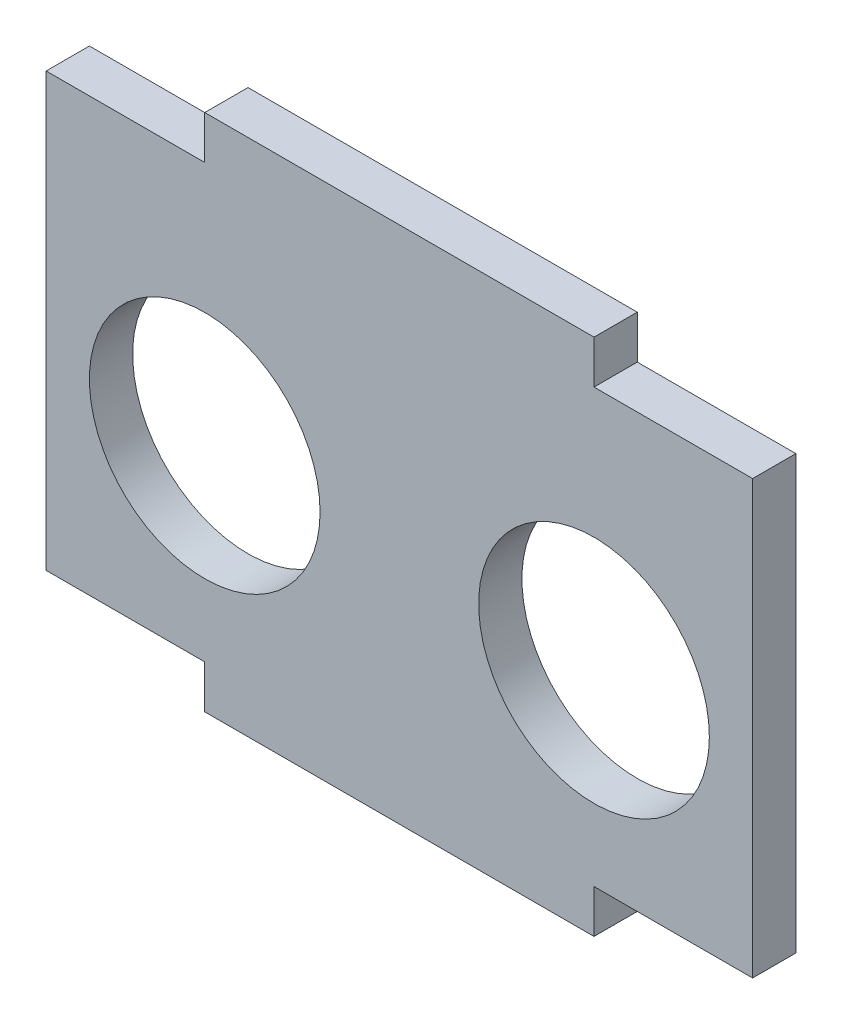
ISO-10303-21;
HEADER;
FILE_DESCRIPTION(('STEP AP214'),'2;1');
FILE_NAME('part.step','',(''),(''),'','','');
FILE_SCHEMA(('AUTOMOTIVE_DESIGN { 1 0 10303 214 1 1 1 1 }'));
ENDSEC;
DATA;
#1=APPLICATION_CONTEXT('core data for automotive mechanical design processes');
#2=APPLICATION_PROTOCOL_DEFINITION('international standard','automotive_design',2000,#1);
#3=PRODUCT_CONTEXT('',#1,'mechanical');
#4=PRODUCT('Part','Part','',(#3));
#5=PRODUCT_RELATED_PRODUCT_CATEGORY('part','',(#4));
#6=PRODUCT_DEFINITION_FORMATION('','',#4);
#7=PRODUCT_DEFINITION_CONTEXT('part definition',#1,'design');
#8=PRODUCT_DEFINITION('design','',#6,#7);
#9=PRODUCT_DEFINITION_SHAPE('','',#8);
#10=(LENGTH_UNIT() NAMED_UNIT(*) SI_UNIT(.MILLI.,.METRE.));
#11=(NAMED_UNIT(*) PLANE_ANGLE_UNIT() SI_UNIT($,.RADIAN.));
#12=(NAMED_UNIT(*) SI_UNIT($,.STERADIAN.) SOLID_ANGLE_UNIT());
#13=UNCERTAINTY_MEASURE_WITH_UNIT(LENGTH_MEASURE(1.E-05),#10,'distance_accuracy_value','');
#14=(GEOMETRIC_REPRESENTATION_CONTEXT(3) GLOBAL_UNCERTAINTY_ASSIGNED_CONTEXT((#13)) GLOBAL_UNIT_ASSIGNED_CONTEXT((#10,
#11,#12)) REPRESENTATION_CONTEXT('',''));
#15=CARTESIAN_POINT('',(0.,0.,0.));
#16=DIRECTION('',(0.,0.,1.));
#17=DIRECTION('',(1.,0.,0.));
#18=AXIS2_PLACEMENT_3D('',#15,#16,#17);
#19=CARTESIAN_POINT('',(0.,0.,3.));
#20=DIRECTION('',(0.,0.,1.));
#21=DIRECTION('',(1.,0.,0.));
#22=AXIS2_PLACEMENT_3D('',#19,#20,#21);
#23=PLANE('',#22);
#24=CARTESIAN_POINT('',(22.949818482808,13.8796514042861,3.));
#25=DIRECTION('',(0.,0.,1.));
#26=DIRECTION('',(1.,0.,0.));
#27=AXIS2_PLACEMENT_3D('',#24,#25,#26);
#28=CIRCLE('',#27,8.);
#29=CARTESIAN_POINT('',(30.949818482808,13.8796514042861,3.));
#30=VERTEX_POINT('',#29);
#31=EDGE_CURVE('E158',#30,#30,#28,.T.);
#32=ORIENTED_EDGE('',*,*,#31,.F.);
#33=EDGE_LOOP('',(#32));
#34=FACE_BOUND('',#33,.T.);
#35=DIRECTION('',(0.99999994345513,0.000336288175742279,0.));
#36=VECTOR('',#35,1.);
#37=CARTESIAN_POINT('',(11.949818482808,0.880696588569519,3.));
#38=LINE('',#37,#36);
#39=CARTESIAN_POINT('',(11.949818482808,0.880696588569519,3.));
#40=VERTEX_POINT('',#39);
#41=CARTESIAN_POINT('',(22.949818482808,0.884395758711853,3.));
#42=VERTEX_POINT('',#41);
#43=EDGE_CURVE('E177',#40,#42,#38,.T.);
#44=ORIENTED_EDGE('',*,*,#43,.T.);
#45=DIRECTION('',(0.,-1.,0.));
#46=VECTOR('',#45,1.);
#47=CARTESIAN_POINT('',(22.949818482808,-2.11560441092277,3.));
#48=LINE('',#47,#46);
#49=CARTESIAN_POINT('',(22.949818482808,-2.11560441092277,3.));
#50=VERTEX_POINT('',#49);
#51=EDGE_CURVE('E105',#42,#50,#48,.T.);
#52=ORIENTED_EDGE('',*,*,#51,.T.);
#53=DIRECTION('',(0.99999994345513,0.000336288175742253,0.));
#54=VECTOR('',#53,1.);
#55=CARTESIAN_POINT('',(22.949818482808,-2.11560441092277,3.));
#56=LINE('',#55,#54);
#57=CARTESIAN_POINT('',(49.949818482808,-2.10652462966431,3.));
#58=VERTEX_POINT('',#57);
#59=EDGE_CURVE('E204',#50,#58,#56,.T.);
#60=ORIENTED_EDGE('',*,*,#59,.T.);
#61=DIRECTION('',(0.,1.,0.));
#62=VECTOR('',#61,1.);
#63=CARTESIAN_POINT('',(49.949818482808,-2.10652462966431,3.));
#64=LINE('',#63,#62);
#65=CARTESIAN_POINT('',(49.949818482808,0.893475539970309,3.));
#66=VERTEX_POINT('',#65);
#67=EDGE_CURVE('E223',#58,#66,#64,.T.);
#68=ORIENTED_EDGE('',*,*,#67,.T.);
#69=DIRECTION('',(0.99999994345513,0.000336288175742288,0.));
#70=VECTOR('',#69,1.);
#71=CARTESIAN_POINT('',(49.949818482808,0.893475539970309,3.));
#72=LINE('',#71,#70);
#73=CARTESIAN_POINT('',(60.949818482808,0.897174710112643,3.));
#74=VERTEX_POINT('',#73);
#75=EDGE_CURVE('E220',#66,#74,#72,.T.);
#76=ORIENTED_EDGE('',*,*,#75,.T.);
#77=DIRECTION('',(0.,1.,0.));
#78=VECTOR('',#77,1.);
#79=CARTESIAN_POINT('',(60.949818482808,0.897174710112643,3.));
#80=LINE('',#79,#78);
#81=CARTESIAN_POINT('',(60.949818482808,30.8971764064588,3.));
#82=VERTEX_POINT('',#81);
#83=EDGE_CURVE('E222',#74,#82,#80,.T.);
#84=ORIENTED_EDGE('',*,*,#83,.T.);
#85=DIRECTION('',(-0.99999994345513,-0.00033628817574286,0.));
#86=VECTOR('',#85,1.);
#87=CARTESIAN_POINT('',(49.949818482808,30.8934772363165,3.));
#88=LINE('',#87,#86);
#89=CARTESIAN_POINT('',(49.949818482808,30.8934772363165,3.));
#90=VERTEX_POINT('',#89);
#91=EDGE_CURVE('E225',#82,#90,#88,.T.);
#92=ORIENTED_EDGE('',*,*,#91,.T.);
#93=DIRECTION('',(0.,1.,0.));
#94=VECTOR('',#93,1.);
#95=CARTESIAN_POINT('',(49.949818482808,30.8934772363165,3.));
#96=LINE('',#95,#94);
#97=CARTESIAN_POINT('',(49.949818482808,33.8934774059511,3.));
#98=VERTEX_POINT('',#97);
#99=EDGE_CURVE('E231',#90,#98,#96,.T.);
#100=ORIENTED_EDGE('',*,*,#99,.T.);
#101=DIRECTION('',(-0.99999994345513,-0.000336288175742253,0.));
#102=VECTOR('',#101,1.);
#103=CARTESIAN_POINT('',(22.949818482808,33.8843976246927,3.));
#104=LINE('',#103,#102);
#105=CARTESIAN_POINT('',(22.949818482808,33.8843976246927,3.));
#106=VERTEX_POINT('',#105);
#107=EDGE_CURVE('E136',#98,#106,#104,.T.);
#108=ORIENTED_EDGE('',*,*,#107,.T.);
#109=DIRECTION('',(0.,-1.,0.));
#110=VECTOR('',#109,1.);
#111=CARTESIAN_POINT('',(22.949818482808,30.8843974550581,3.));
#112=LINE('',#111,#110);
#113=CARTESIAN_POINT('',(22.949818482808,30.8843974550581,3.));
#114=VERTEX_POINT('',#113);
#115=EDGE_CURVE('E130',#106,#114,#112,.T.);
#116=ORIENTED_EDGE('',*,*,#115,.T.);
#117=DIRECTION('',(-0.99999994345513,-0.000336288175742229,0.));
#118=VECTOR('',#117,1.);
#119=CARTESIAN_POINT('',(11.949818482808,30.8806982849157,3.));
#120=LINE('',#119,#118);
#121=CARTESIAN_POINT('',(11.949818482808,30.8806982849157,3.));
#122=VERTEX_POINT('',#121);
#123=EDGE_CURVE('E134',#114,#122,#120,.T.);
#124=ORIENTED_EDGE('',*,*,#123,.T.);
#125=DIRECTION('',(0.,-1.,0.));
#126=VECTOR('',#125,1.);
#127=CARTESIAN_POINT('',(11.949818482808,0.880696588569519,3.));
#128=LINE('',#127,#126);
#129=EDGE_CURVE('E50',#122,#40,#128,.T.);
#130=ORIENTED_EDGE('',*,*,#129,.T.);
#131=EDGE_LOOP('',(#44,#52,#60,#68,#76,#84,#92,#100,#108,#116,#124,#130));
#132=FACE_BOUND('',#131,.T.);
#133=CARTESIAN_POINT('',(49.949818482808,13.8796514042861,3.));
#134=DIRECTION('',(0.,0.,1.));
#135=DIRECTION('',(1.,0.,0.));
#136=AXIS2_PLACEMENT_3D('',#133,#134,#135);
#137=CIRCLE('',#136,8.);
#138=CARTESIAN_POINT('',(57.949818482808,13.8796514042861,3.));
#139=VERTEX_POINT('',#138);
#140=EDGE_CURVE('E274',#139,#139,#137,.T.);
#141=ORIENTED_EDGE('',*,*,#140,.F.);
#142=EDGE_LOOP('',(#141));
#143=FACE_BOUND('',#142,.T.);
#144=ADVANCED_FACE('F33',(#34,#132,#143),#23,.T.);
#145=CARTESIAN_POINT('',(0.,0.,0.));
#146=DIRECTION('',(0.,0.,1.));
#147=DIRECTION('',(1.,0.,0.));
#148=AXIS2_PLACEMENT_3D('',#145,#146,#147);
#149=PLANE('',#148);
#150=CARTESIAN_POINT('',(22.949818482808,13.8796514042861,0.));
#151=DIRECTION('',(0.,0.,1.));
#152=DIRECTION('',(1.,0.,0.));
#153=AXIS2_PLACEMENT_3D('',#150,#151,#152);
#154=CIRCLE('',#153,8.);
#155=CARTESIAN_POINT('',(30.949818482808,13.8796514042861,0.));
#156=VERTEX_POINT('',#155);
#157=EDGE_CURVE('E279',#156,#156,#154,.T.);
#158=ORIENTED_EDGE('',*,*,#157,.T.);
#159=EDGE_LOOP('',(#158));
#160=FACE_BOUND('',#159,.T.);
#161=DIRECTION('',(0.99999994345513,0.000336288175742279,0.));
#162=VECTOR('',#161,1.);
#163=CARTESIAN_POINT('',(11.949818482808,0.880696588569519,0.));
#164=LINE('',#163,#162);
#165=CARTESIAN_POINT('',(11.949818482808,0.880696588569519,0.));
#166=VERTEX_POINT('',#165);
#167=CARTESIAN_POINT('',(22.949818482808,0.884395758711853,0.));
#168=VERTEX_POINT('',#167);
#169=EDGE_CURVE('E154',#166,#168,#164,.T.);
#170=ORIENTED_EDGE('',*,*,#169,.F.);
#171=DIRECTION('',(0.,-1.,0.));
#172=VECTOR('',#171,1.);
#173=CARTESIAN_POINT('',(11.949818482808,0.880696588569519,0.));
#174=LINE('',#173,#172);
#175=CARTESIAN_POINT('',(11.949818482808,30.8806982849157,0.));
#176=VERTEX_POINT('',#175);
#177=EDGE_CURVE('E97',#176,#166,#174,.T.);
#178=ORIENTED_EDGE('',*,*,#177,.F.);
#179=DIRECTION('',(-0.99999994345513,-0.000336288175742229,0.));
#180=VECTOR('',#179,1.);
#181=CARTESIAN_POINT('',(11.949818482808,30.8806982849157,0.));
#182=LINE('',#181,#180);
#183=CARTESIAN_POINT('',(22.949818482808,30.8843974550581,0.));
#184=VERTEX_POINT('',#183);
#185=EDGE_CURVE('E91',#184,#176,#182,.T.);
#186=ORIENTED_EDGE('',*,*,#185,.F.);
#187=DIRECTION('',(0.,-1.,0.));
#188=VECTOR('',#187,1.);
#189=CARTESIAN_POINT('',(22.949818482808,30.8843974550581,0.));
#190=LINE('',#189,#188);
#191=CARTESIAN_POINT('',(22.949818482808,33.8843976246927,0.));
#192=VERTEX_POINT('',#191);
#193=EDGE_CURVE('E144',#192,#184,#190,.T.);
#194=ORIENTED_EDGE('',*,*,#193,.F.);
#195=DIRECTION('',(-0.99999994345513,-0.000336288175742253,0.));
#196=VECTOR('',#195,1.);
#197=CARTESIAN_POINT('',(22.949818482808,33.8843976246927,0.));
#198=LINE('',#197,#196);
#199=CARTESIAN_POINT('',(49.949818482808,33.8934774059511,0.));
#200=VERTEX_POINT('',#199);
#201=EDGE_CURVE('E172',#200,#192,#198,.T.);
#202=ORIENTED_EDGE('',*,*,#201,.F.);
#203=DIRECTION('',(0.,1.,0.));
#204=VECTOR('',#203,1.);
#205=CARTESIAN_POINT('',(49.949818482808,30.8934772363165,0.));
#206=LINE('',#205,#204);
#207=CARTESIAN_POINT('',(49.949818482808,30.8934772363165,0.));
#208=VERTEX_POINT('',#207);
#209=EDGE_CURVE('E170',#208,#200,#206,.T.);
#210=ORIENTED_EDGE('',*,*,#209,.F.);
#211=DIRECTION('',(-0.99999994345513,-0.00033628817574286,0.));
#212=VECTOR('',#211,1.);
#213=CARTESIAN_POINT('',(49.949818482808,30.8934772363165,0.));
#214=LINE('',#213,#212);
#215=CARTESIAN_POINT('',(60.949818482808,30.8971764064588,0.));
#216=VERTEX_POINT('',#215);
#217=EDGE_CURVE('E168',#216,#208,#214,.T.);
#218=ORIENTED_EDGE('',*,*,#217,.F.);
#219=DIRECTION('',(0.,1.,0.));
#220=VECTOR('',#219,1.);
#221=CARTESIAN_POINT('',(60.949818482808,0.897174710112643,0.));
#222=LINE('',#221,#220);
#223=CARTESIAN_POINT('',(60.949818482808,0.897174710112643,0.));
#224=VERTEX_POINT('',#223);
#225=EDGE_CURVE('E166',#224,#216,#222,.T.);
#226=ORIENTED_EDGE('',*,*,#225,.F.);
#227=DIRECTION('',(0.99999994345513,0.000336288175742288,0.));
#228=VECTOR('',#227,1.);
#229=CARTESIAN_POINT('',(49.949818482808,0.893475539970309,0.));
#230=LINE('',#229,#228);
#231=CARTESIAN_POINT('',(49.949818482808,0.893475539970309,0.));
#232=VERTEX_POINT('',#231);
#233=EDGE_CURVE('E164',#232,#224,#230,.T.);
#234=ORIENTED_EDGE('',*,*,#233,.F.);
#235=DIRECTION('',(0.,1.,0.));
#236=VECTOR('',#235,1.);
#237=CARTESIAN_POINT('',(49.949818482808,-2.10652462966431,0.));
#238=LINE('',#237,#236);
#239=CARTESIAN_POINT('',(49.949818482808,-2.10652462966431,0.));
#240=VERTEX_POINT('',#239);
#241=EDGE_CURVE('E162',#240,#232,#238,.T.);
#242=ORIENTED_EDGE('',*,*,#241,.F.);
#243=DIRECTION('',(0.99999994345513,0.000336288175742253,0.));
#244=VECTOR('',#243,1.);
#245=CARTESIAN_POINT('',(22.949818482808,-2.11560441092277,0.));
#246=LINE('',#245,#244);
#247=CARTESIAN_POINT('',(22.949818482808,-2.11560441092277,0.));
#248=VERTEX_POINT('',#247);
#249=EDGE_CURVE('E160',#248,#240,#246,.T.);
#250=ORIENTED_EDGE('',*,*,#249,.F.);
#251=DIRECTION('',(0.,-1.,0.));
#252=VECTOR('',#251,1.);
#253=CARTESIAN_POINT('',(22.949818482808,-2.11560441092277,0.));
#254=LINE('',#253,#252);
#255=EDGE_CURVE('E157',#168,#248,#254,.T.);
#256=ORIENTED_EDGE('',*,*,#255,.F.);
#257=EDGE_LOOP('',(#170,#178,#186,#194,#202,#210,#218,#226,#234,#242,#250,#256));
#258=FACE_BOUND('',#257,.T.);
#259=CARTESIAN_POINT('',(49.949818482808,13.8796514042861,0.));
#260=DIRECTION('',(0.,0.,1.));
#261=DIRECTION('',(1.,0.,0.));
#262=AXIS2_PLACEMENT_3D('',#259,#260,#261);
#263=CIRCLE('',#262,8.);
#264=CARTESIAN_POINT('',(57.949818482808,13.8796514042861,0.));
#265=VERTEX_POINT('',#264);
#266=EDGE_CURVE('E277',#265,#265,#263,.T.);
#267=ORIENTED_EDGE('',*,*,#266,.T.);
#268=EDGE_LOOP('',(#267));
#269=FACE_BOUND('',#268,.T.);
#270=ADVANCED_FACE('F208',(#160,#258,#269),#149,.F.);
#271=CARTESIAN_POINT('',(11.949818482808,0.880696588569519,3.));
#272=DIRECTION('',(-0.000336288175742279,0.99999994345513,0.));
#273=DIRECTION('',(-0.99999994345513,-0.000336288175742279,0.));
#274=AXIS2_PLACEMENT_3D('',#271,#272,#273);
#275=PLANE('',#274);
#276=ORIENTED_EDGE('',*,*,#169,.T.);
#277=DIRECTION('',(0.,0.,-1.));
#278=VECTOR('',#277,1.);
#279=CARTESIAN_POINT('',(22.949818482808,0.884395758711853,3.));
#280=LINE('',#279,#278);
#281=EDGE_CURVE('E11',#42,#168,#280,.T.);
#282=ORIENTED_EDGE('',*,*,#281,.F.);
#283=ORIENTED_EDGE('',*,*,#43,.F.);
#284=DIRECTION('',(0.,0.,-1.));
#285=VECTOR('',#284,1.);
#286=CARTESIAN_POINT('',(11.949818482808,0.880696588569519,3.));
#287=LINE('',#286,#285);
#288=EDGE_CURVE('E150',#40,#166,#287,.T.);
#289=ORIENTED_EDGE('',*,*,#288,.T.);
#290=EDGE_LOOP('',(#276,#282,#283,#289));
#291=FACE_BOUND('',#290,.T.);
#292=ADVANCED_FACE('F35',(#291),#275,.F.);
#293=CARTESIAN_POINT('',(22.949818482808,-2.11560441092277,3.));
#294=DIRECTION('',(1.,0.,0.));
#295=DIRECTION('',(0.,1.,0.));
#296=AXIS2_PLACEMENT_3D('',#293,#294,#295);
#297=PLANE('',#296);
#298=ORIENTED_EDGE('',*,*,#255,.T.);
#299=DIRECTION('',(0.,0.,-1.));
#300=VECTOR('',#299,1.);
#301=CARTESIAN_POINT('',(22.949818482808,-2.11560441092277,3.));
#302=LINE('',#301,#300);
#303=EDGE_CURVE('E42',#50,#248,#302,.T.);
#304=ORIENTED_EDGE('',*,*,#303,.F.);
#305=ORIENTED_EDGE('',*,*,#51,.F.);
#306=ORIENTED_EDGE('',*,*,#281,.T.);
#307=EDGE_LOOP('',(#298,#304,#305,#306));
#308=FACE_BOUND('',#307,.T.);
#309=ADVANCED_FACE('F372',(#308),#297,.F.);
#310=CARTESIAN_POINT('',(22.949818482808,-2.11560441092277,3.));
#311=DIRECTION('',(-0.000336288175742253,0.99999994345513,0.));
#312=DIRECTION('',(-0.99999994345513,-0.000336288175742253,0.));
#313=AXIS2_PLACEMENT_3D('',#310,#311,#312);
#314=PLANE('',#313);
#315=ORIENTED_EDGE('',*,*,#249,.T.);
#316=DIRECTION('',(0.,0.,-1.));
#317=VECTOR('',#316,1.);
#318=CARTESIAN_POINT('',(49.949818482808,-2.10652462966431,3.));
#319=LINE('',#318,#317);
#320=EDGE_CURVE('E196',#58,#240,#319,.T.);
#321=ORIENTED_EDGE('',*,*,#320,.F.);
#322=ORIENTED_EDGE('',*,*,#59,.F.);
#323=ORIENTED_EDGE('',*,*,#303,.T.);
#324=EDGE_LOOP('',(#315,#321,#322,#323));
#325=FACE_BOUND('',#324,.T.);
#326=ADVANCED_FACE('F202',(#325),#314,.F.);
#327=CARTESIAN_POINT('',(49.949818482808,-2.10652462966431,3.));
#328=DIRECTION('',(-1.,0.,0.));
#329=DIRECTION('',(0.,0.,1.));
#330=AXIS2_PLACEMENT_3D('',#327,#328,#329);
#331=PLANE('',#330);
#332=ORIENTED_EDGE('',*,*,#241,.T.);
#333=DIRECTION('',(0.,0.,-1.));
#334=VECTOR('',#333,1.);
#335=CARTESIAN_POINT('',(49.949818482808,0.893475539970309,3.));
#336=LINE('',#335,#334);
#337=EDGE_CURVE('E193',#66,#232,#336,.T.);
#338=ORIENTED_EDGE('',*,*,#337,.F.);
#339=ORIENTED_EDGE('',*,*,#67,.F.);
#340=ORIENTED_EDGE('',*,*,#320,.T.);
#341=EDGE_LOOP('',(#332,#338,#339,#340));
#342=FACE_BOUND('',#341,.T.);
#343=ADVANCED_FACE('F214',(#342),#331,.F.);
#344=CARTESIAN_POINT('',(49.949818482808,0.893475539970309,3.));
#345=DIRECTION('',(-0.000336288175742288,0.99999994345513,0.));
#346=DIRECTION('',(-0.99999994345513,-0.000336288175742288,0.));
#347=AXIS2_PLACEMENT_3D('',#344,#345,#346);
#348=PLANE('',#347);
#349=ORIENTED_EDGE('',*,*,#233,.T.);
#350=DIRECTION('',(0.,0.,-1.));
#351=VECTOR('',#350,1.);
#352=CARTESIAN_POINT('',(60.949818482808,0.897174710112643,3.));
#353=LINE('',#352,#351);
#354=EDGE_CURVE('E190',#74,#224,#353,.T.);
#355=ORIENTED_EDGE('',*,*,#354,.F.);
#356=ORIENTED_EDGE('',*,*,#75,.F.);
#357=ORIENTED_EDGE('',*,*,#337,.T.);
#358=EDGE_LOOP('',(#349,#355,#356,#357));
#359=FACE_BOUND('',#358,.T.);
#360=ADVANCED_FACE('F218',(#359),#348,.F.);
#361=CARTESIAN_POINT('',(60.949818482808,0.897174710112643,3.));
#362=DIRECTION('',(-1.,0.,0.));
#363=DIRECTION('',(0.,0.,1.));
#364=AXIS2_PLACEMENT_3D('',#361,#362,#363);
#365=PLANE('',#364);
#366=ORIENTED_EDGE('',*,*,#225,.T.);
#367=DIRECTION('',(0.,0.,-1.));
#368=VECTOR('',#367,1.);
#369=CARTESIAN_POINT('',(60.949818482808,30.8971764064588,3.));
#370=LINE('',#369,#368);
#371=EDGE_CURVE('E187',#82,#216,#370,.T.);
#372=ORIENTED_EDGE('',*,*,#371,.F.);
#373=ORIENTED_EDGE('',*,*,#83,.F.);
#374=ORIENTED_EDGE('',*,*,#354,.T.);
#375=EDGE_LOOP('',(#366,#372,#373,#374));
#376=FACE_BOUND('',#375,.T.);
#377=ADVANCED_FACE('F337',(#376),#365,.F.);
#378=CARTESIAN_POINT('',(49.949818482808,30.8934772363165,3.));
#379=DIRECTION('',(0.00033628817574286,-0.99999994345513,0.));
#380=DIRECTION('',(0.99999994345513,0.00033628817574286,0.));
#381=AXIS2_PLACEMENT_3D('',#378,#379,#380);
#382=PLANE('',#381);
#383=ORIENTED_EDGE('',*,*,#217,.T.);
#384=DIRECTION('',(0.,0.,-1.));
#385=VECTOR('',#384,1.);
#386=CARTESIAN_POINT('',(49.949818482808,30.8934772363165,3.));
#387=LINE('',#386,#385);
#388=EDGE_CURVE('E184',#90,#208,#387,.T.);
#389=ORIENTED_EDGE('',*,*,#388,.F.);
#390=ORIENTED_EDGE('',*,*,#91,.F.);
#391=ORIENTED_EDGE('',*,*,#371,.T.);
#392=EDGE_LOOP('',(#383,#389,#390,#391));
#393=FACE_BOUND('',#392,.T.);
#394=ADVANCED_FACE('F328',(#393),#382,.F.);
#395=CARTESIAN_POINT('',(49.949818482808,30.8934772363165,3.));
#396=DIRECTION('',(-1.,0.,0.));
#397=DIRECTION('',(0.,0.,1.));
#398=AXIS2_PLACEMENT_3D('',#395,#396,#397);
#399=PLANE('',#398);
#400=ORIENTED_EDGE('',*,*,#209,.T.);
#401=DIRECTION('',(0.,0.,-1.));
#402=VECTOR('',#401,1.);
#403=CARTESIAN_POINT('',(49.949818482808,33.8934774059511,3.));
#404=LINE('',#403,#402);
#405=EDGE_CURVE('E181',#98,#200,#404,.T.);
#406=ORIENTED_EDGE('',*,*,#405,.F.);
#407=ORIENTED_EDGE('',*,*,#99,.F.);
#408=ORIENTED_EDGE('',*,*,#388,.T.);
#409=EDGE_LOOP('',(#400,#406,#407,#408));
#410=FACE_BOUND('',#409,.T.);
#411=ADVANCED_FACE('F237',(#410),#399,.F.);
#412=CARTESIAN_POINT('',(22.949818482808,33.8843976246927,3.));
#413=DIRECTION('',(0.000336288175742253,-0.99999994345513,0.));
#414=DIRECTION('',(0.99999994345513,0.000336288175742253,0.));
#415=AXIS2_PLACEMENT_3D('',#412,#413,#414);
#416=PLANE('',#415);
#417=ORIENTED_EDGE('',*,*,#201,.T.);
#418=DIRECTION('',(0.,0.,-1.));
#419=VECTOR('',#418,1.);
#420=CARTESIAN_POINT('',(22.949818482808,33.8843976246927,3.));
#421=LINE('',#420,#419);
#422=EDGE_CURVE('E145',#106,#192,#421,.T.);
#423=ORIENTED_EDGE('',*,*,#422,.F.);
#424=ORIENTED_EDGE('',*,*,#107,.F.);
#425=ORIENTED_EDGE('',*,*,#405,.T.);
#426=EDGE_LOOP('',(#417,#423,#424,#425));
#427=FACE_BOUND('',#426,.T.);
#428=ADVANCED_FACE('F241',(#427),#416,.F.);
#429=CARTESIAN_POINT('',(22.949818482808,30.8843974550581,3.));
#430=DIRECTION('',(1.,0.,0.));
#431=DIRECTION('',(0.,1.,0.));
#432=AXIS2_PLACEMENT_3D('',#429,#430,#431);
#433=PLANE('',#432);
#434=ORIENTED_EDGE('',*,*,#193,.T.);
#435=DIRECTION('',(0.,0.,-1.));
#436=VECTOR('',#435,1.);
#437=CARTESIAN_POINT('',(22.949818482808,30.8843974550581,3.));
#438=LINE('',#437,#436);
#439=EDGE_CURVE('E141',#114,#184,#438,.T.);
#440=ORIENTED_EDGE('',*,*,#439,.F.);
#441=ORIENTED_EDGE('',*,*,#115,.F.);
#442=ORIENTED_EDGE('',*,*,#422,.T.);
#443=EDGE_LOOP('',(#434,#440,#441,#442));
#444=FACE_BOUND('',#443,.T.);
#445=ADVANCED_FACE('F142',(#444),#433,.F.);
#446=CARTESIAN_POINT('',(11.949818482808,30.8806982849157,3.));
#447=DIRECTION('',(0.000336288175742229,-0.99999994345513,0.));
#448=DIRECTION('',(0.99999994345513,0.000336288175742229,0.));
#449=AXIS2_PLACEMENT_3D('',#446,#447,#448);
#450=PLANE('',#449);
#451=ORIENTED_EDGE('',*,*,#185,.T.);
#452=DIRECTION('',(0.,0.,-1.));
#453=VECTOR('',#452,1.);
#454=CARTESIAN_POINT('',(11.949818482808,30.8806982849157,3.));
#455=LINE('',#454,#453);
#456=EDGE_CURVE('E146',#122,#176,#455,.T.);
#457=ORIENTED_EDGE('',*,*,#456,.F.);
#458=ORIENTED_EDGE('',*,*,#123,.F.);
#459=ORIENTED_EDGE('',*,*,#439,.T.);
#460=EDGE_LOOP('',(#451,#457,#458,#459));
#461=FACE_BOUND('',#460,.T.);
#462=ADVANCED_FACE('F148',(#461),#450,.F.);
#463=CARTESIAN_POINT('',(11.949818482808,0.880696588569519,3.));
#464=DIRECTION('',(1.,0.,0.));
#465=DIRECTION('',(0.,1.,0.));
#466=AXIS2_PLACEMENT_3D('',#463,#464,#465);
#467=PLANE('',#466);
#468=ORIENTED_EDGE('',*,*,#177,.T.);
#469=ORIENTED_EDGE('',*,*,#288,.F.);
#470=ORIENTED_EDGE('',*,*,#129,.F.);
#471=ORIENTED_EDGE('',*,*,#456,.T.);
#472=EDGE_LOOP('',(#468,#469,#470,#471));
#473=FACE_BOUND('',#472,.T.);
#474=ADVANCED_FACE('F245',(#473),#467,.F.);
#475=CARTESIAN_POINT('',(22.949818482808,13.8796514042861,3.));
#476=DIRECTION('',(0.,0.,-1.));
#477=DIRECTION('',(-1.,0.,0.));
#478=AXIS2_PLACEMENT_3D('',#475,#476,#477);
#479=CYLINDRICAL_SURFACE('',#478,8.);
#480=ORIENTED_EDGE('',*,*,#31,.T.);
#481=EDGE_LOOP('',(#480));
#482=FACE_BOUND('',#481,.T.);
#483=ORIENTED_EDGE('',*,*,#157,.F.);
#484=EDGE_LOOP('',(#483));
#485=FACE_BOUND('',#484,.T.);
#486=ADVANCED_FACE('F247',(#482,#485),#479,.F.);
#487=CARTESIAN_POINT('',(49.949818482808,13.8796514042861,3.));
#488=DIRECTION('',(0.,0.,-1.));
#489=DIRECTION('',(-1.,0.,0.));
#490=AXIS2_PLACEMENT_3D('',#487,#488,#489);
#491=CYLINDRICAL_SURFACE('',#490,8.);
#492=ORIENTED_EDGE('',*,*,#140,.T.);
#493=EDGE_LOOP('',(#492));
#494=FACE_BOUND('',#493,.T.);
#495=ORIENTED_EDGE('',*,*,#266,.F.);
#496=EDGE_LOOP('',(#495));
#497=FACE_BOUND('',#496,.T.);
#498=ADVANCED_FACE('F253',(#494,#497),#491,.F.);
#499=CLOSED_SHELL('',(#144,#270,#292,#309,#326,#343,#360,#377,#394,#411,#428,#445,#462,#474,
#486,#498));
#500=MANIFOLD_SOLID_BREP('B2',#499);
#501=ADVANCED_BREP_SHAPE_REPRESENTATION('',(#18,#500),#14);
#502=SHAPE_DEFINITION_REPRESENTATION(#9,#501);
ENDSEC;
END-ISO-10303-21;
